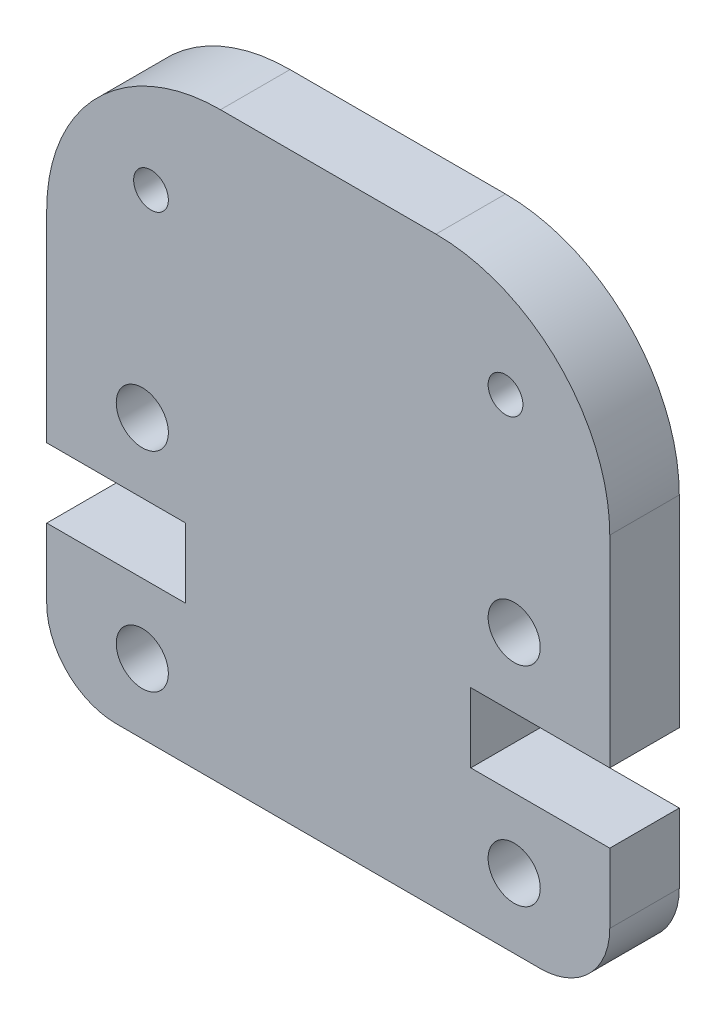
ISO-10303-21;
HEADER;
FILE_DESCRIPTION(('STEP AP214'),'2;1');
FILE_NAME('part.step','',(''),(''),'','','');
FILE_SCHEMA(('AUTOMOTIVE_DESIGN { 1 0 10303 214 1 1 1 1 }'));
ENDSEC;
DATA;
#1=APPLICATION_CONTEXT('core data for automotive mechanical design processes');
#2=APPLICATION_PROTOCOL_DEFINITION('international standard','automotive_design',2000,#1);
#3=PRODUCT_CONTEXT('',#1,'mechanical');
#4=PRODUCT('Part','Part','',(#3));
#5=PRODUCT_RELATED_PRODUCT_CATEGORY('part','',(#4));
#6=PRODUCT_DEFINITION_FORMATION('','',#4);
#7=PRODUCT_DEFINITION_CONTEXT('part definition',#1,'design');
#8=PRODUCT_DEFINITION('design','',#6,#7);
#9=PRODUCT_DEFINITION_SHAPE('','',#8);
#10=(LENGTH_UNIT() NAMED_UNIT(*) SI_UNIT(.MILLI.,.METRE.));
#11=(NAMED_UNIT(*) PLANE_ANGLE_UNIT() SI_UNIT($,.RADIAN.));
#12=(NAMED_UNIT(*) SI_UNIT($,.STERADIAN.) SOLID_ANGLE_UNIT());
#13=UNCERTAINTY_MEASURE_WITH_UNIT(LENGTH_MEASURE(1.E-05),#10,'distance_accuracy_value','');
#14=(GEOMETRIC_REPRESENTATION_CONTEXT(3) GLOBAL_UNCERTAINTY_ASSIGNED_CONTEXT((#13)) GLOBAL_UNIT_ASSIGNED_CONTEXT((#10,
#11,#12)) REPRESENTATION_CONTEXT('',''));
#15=CARTESIAN_POINT('',(0.,0.,0.));
#16=DIRECTION('',(0.,0.,1.));
#17=DIRECTION('',(1.,0.,0.));
#18=AXIS2_PLACEMENT_3D('',#15,#16,#17);
#19=CARTESIAN_POINT('',(14.2000000000041,1.99999999999997,2.));
#20=DIRECTION('',(0.,0.,1.));
#21=DIRECTION('',(1.,0.,0.));
#22=AXIS2_PLACEMENT_3D('',#19,#20,#21);
#23=PLANE('',#22);
#24=CARTESIAN_POINT('',(13.4500000000012,7.99999999999992,2.));
#25=DIRECTION('',(0.,0.,1.));
#26=DIRECTION('',(-1.,0.,0.));
#27=AXIS2_PLACEMENT_3D('',#24,#25,#26);
#28=CIRCLE('',#27,0.75);
#29=CARTESIAN_POINT('',(12.7000000000012,7.99999999999992,2.));
#30=VERTEX_POINT('',#29);
#31=EDGE_CURVE('E351',#30,#30,#28,.T.);
#32=ORIENTED_EDGE('',*,*,#31,.F.);
#33=EDGE_LOOP('',(#32));
#34=FACE_BOUND('',#33,.T.);
#35=CARTESIAN_POINT('',(13.4500000000022,1.99999999999784,2.));
#36=DIRECTION('',(0.,0.,1.));
#37=DIRECTION('',(1.,0.,0.));
#38=AXIS2_PLACEMENT_3D('',#35,#36,#37);
#39=CIRCLE('',#38,0.75);
#40=CARTESIAN_POINT('',(14.2000000000022,1.99999999999784,2.));
#41=VERTEX_POINT('',#40);
#42=EDGE_CURVE('E363',#41,#41,#39,.T.);
#43=ORIENTED_EDGE('',*,*,#42,.F.);
#44=EDGE_LOOP('',(#43));
#45=FACE_BOUND('',#44,.T.);
#46=CARTESIAN_POINT('',(3.00000000000434,13.7999999999999,2.));
#47=DIRECTION('',(0.,0.,1.));
#48=DIRECTION('',(1.,0.,0.));
#49=AXIS2_PLACEMENT_3D('',#46,#47,#48);
#50=CIRCLE('',#49,0.499999999999945);
#51=CARTESIAN_POINT('',(3.50000000000429,13.7999999999999,2.));
#52=VERTEX_POINT('',#51);
#53=EDGE_CURVE('E181',#52,#52,#50,.T.);
#54=ORIENTED_EDGE('',*,*,#53,.F.);
#55=EDGE_LOOP('',(#54));
#56=FACE_BOUND('',#55,.T.);
#57=CARTESIAN_POINT('',(14.2000000000041,1.99999999999997,2.));
#58=DIRECTION('',(0.,0.,1.));
#59=DIRECTION('',(1.,0.,0.));
#60=AXIS2_PLACEMENT_3D('',#57,#58,#59);
#61=CIRCLE('',#60,1.99999999999997);
#62=CARTESIAN_POINT('',(14.1999999999992,0.,2.));
#63=VERTEX_POINT('',#62);
#64=CARTESIAN_POINT('',(16.2000000000041,1.99999999999978,2.));
#65=VERTEX_POINT('',#64);
#66=EDGE_CURVE('E208',#63,#65,#61,.T.);
#67=ORIENTED_EDGE('',*,*,#66,.T.);
#68=DIRECTION('',(0.,1.,0.));
#69=VECTOR('',#68,1.);
#70=CARTESIAN_POINT('',(16.2000000000041,1.99999999999978,2.));
#71=LINE('',#70,#69);
#72=CARTESIAN_POINT('',(16.2000000000041,4.,2.));
#73=VERTEX_POINT('',#72);
#74=EDGE_CURVE('E116',#65,#73,#71,.T.);
#75=ORIENTED_EDGE('',*,*,#74,.T.);
#76=DIRECTION('',(-1.,0.,0.));
#77=VECTOR('',#76,1.);
#78=CARTESIAN_POINT('',(12.200000000003,4.,2.));
#79=LINE('',#78,#77);
#80=CARTESIAN_POINT('',(12.200000000003,4.,2.));
#81=VERTEX_POINT('',#80);
#82=EDGE_CURVE('E247',#73,#81,#79,.T.);
#83=ORIENTED_EDGE('',*,*,#82,.T.);
#84=DIRECTION('',(0.,1.,0.));
#85=VECTOR('',#84,1.);
#86=CARTESIAN_POINT('',(12.200000000003,5.99999999999998,2.));
#87=LINE('',#86,#85);
#88=CARTESIAN_POINT('',(12.200000000003,5.99999999999998,2.));
#89=VERTEX_POINT('',#88);
#90=EDGE_CURVE('E266',#81,#89,#87,.T.);
#91=ORIENTED_EDGE('',*,*,#90,.T.);
#92=DIRECTION('',(1.,0.,0.));
#93=VECTOR('',#92,1.);
#94=CARTESIAN_POINT('',(16.1999999999961,5.99999999999998,2.));
#95=LINE('',#94,#93);
#96=CARTESIAN_POINT('',(16.1999999999961,5.99999999999998,2.));
#97=VERTEX_POINT('',#96);
#98=EDGE_CURVE('E263',#89,#97,#95,.T.);
#99=ORIENTED_EDGE('',*,*,#98,.T.);
#100=DIRECTION('',(0.,1.,0.));
#101=VECTOR('',#100,1.);
#102=CARTESIAN_POINT('',(16.1999999999961,11.7999999999986,2.));
#103=LINE('',#102,#101);
#104=CARTESIAN_POINT('',(16.1999999999961,11.7999999999986,2.));
#105=VERTEX_POINT('',#104);
#106=EDGE_CURVE('E265',#97,#105,#103,.T.);
#107=ORIENTED_EDGE('',*,*,#106,.T.);
#108=CARTESIAN_POINT('',(11.1999999999948,11.7999999999987,2.));
#109=DIRECTION('',(0.,0.,1.));
#110=DIRECTION('',(1.,0.,0.));
#111=AXIS2_PLACEMENT_3D('',#108,#109,#110);
#112=CIRCLE('',#111,5.00000000000135);
#113=CARTESIAN_POINT('',(11.1999999999961,16.8,2.));
#114=VERTEX_POINT('',#113);
#115=EDGE_CURVE('E268',#105,#114,#112,.T.);
#116=ORIENTED_EDGE('',*,*,#115,.T.);
#117=DIRECTION('',(-1.,0.,0.));
#118=VECTOR('',#117,1.);
#119=CARTESIAN_POINT('',(4.99999999999334,16.8,2.));
#120=LINE('',#119,#118);
#121=CARTESIAN_POINT('',(4.99999999999334,16.8,2.));
#122=VERTEX_POINT('',#121);
#123=EDGE_CURVE('E274',#114,#122,#120,.T.);
#124=ORIENTED_EDGE('',*,*,#123,.T.);
#125=CARTESIAN_POINT('',(5.,11.8,2.));
#126=DIRECTION('',(0.,0.,1.));
#127=DIRECTION('',(1.,0.,0.));
#128=AXIS2_PLACEMENT_3D('',#125,#126,#127);
#129=CIRCLE('',#128,5.00000000000001);
#130=CARTESIAN_POINT('',(0.,11.8,2.));
#131=VERTEX_POINT('',#130);
#132=EDGE_CURVE('E276',#122,#131,#129,.T.);
#133=ORIENTED_EDGE('',*,*,#132,.T.);
#134=DIRECTION('',(0.,-1.,0.));
#135=VECTOR('',#134,1.);
#136=CARTESIAN_POINT('',(0.,6.00000000000001,2.));
#137=LINE('',#136,#135);
#138=CARTESIAN_POINT('',(0.,6.00000000000001,2.));
#139=VERTEX_POINT('',#138);
#140=EDGE_CURVE('E278',#131,#139,#137,.T.);
#141=ORIENTED_EDGE('',*,*,#140,.T.);
#142=DIRECTION('',(1.,0.,0.));
#143=VECTOR('',#142,1.);
#144=CARTESIAN_POINT('',(0.,6.00000000000001,2.));
#145=LINE('',#144,#143);
#146=CARTESIAN_POINT('',(4.00000000000111,6.00000000000001,2.));
#147=VERTEX_POINT('',#146);
#148=EDGE_CURVE('E280',#139,#147,#145,.T.);
#149=ORIENTED_EDGE('',*,*,#148,.T.);
#150=DIRECTION('',(0.,-1.,0.));
#151=VECTOR('',#150,1.);
#152=CARTESIAN_POINT('',(4.00000000000111,6.00000000000001,2.));
#153=LINE('',#152,#151);
#154=CARTESIAN_POINT('',(4.00000000000111,4.,2.));
#155=VERTEX_POINT('',#154);
#156=EDGE_CURVE('E282',#147,#155,#153,.T.);
#157=ORIENTED_EDGE('',*,*,#156,.T.);
#158=DIRECTION('',(-1.,0.,0.));
#159=VECTOR('',#158,1.);
#160=CARTESIAN_POINT('',(4.00000000000111,4.,2.));
#161=LINE('',#160,#159);
#162=CARTESIAN_POINT('',(0.,4.,2.));
#163=VERTEX_POINT('',#162);
#164=EDGE_CURVE('E159',#155,#163,#161,.T.);
#165=ORIENTED_EDGE('',*,*,#164,.T.);
#166=DIRECTION('',(0.,-1.,0.));
#167=VECTOR('',#166,1.);
#168=CARTESIAN_POINT('',(0.,2.,2.));
#169=LINE('',#168,#167);
#170=CARTESIAN_POINT('',(0.,2.,2.));
#171=VERTEX_POINT('',#170);
#172=EDGE_CURVE('E153',#163,#171,#169,.T.);
#173=ORIENTED_EDGE('',*,*,#172,.T.);
#174=CARTESIAN_POINT('',(2.,2.,2.));
#175=DIRECTION('',(0.,0.,1.));
#176=DIRECTION('',(1.,0.,0.));
#177=AXIS2_PLACEMENT_3D('',#174,#175,#176);
#178=CIRCLE('',#177,2.);
#179=CARTESIAN_POINT('',(2.,0.,2.));
#180=VERTEX_POINT('',#179);
#181=EDGE_CURVE('E157',#171,#180,#178,.T.);
#182=ORIENTED_EDGE('',*,*,#181,.T.);
#183=DIRECTION('',(1.,0.,0.));
#184=VECTOR('',#183,1.);
#185=CARTESIAN_POINT('',(2.,0.,2.));
#186=LINE('',#185,#184);
#187=EDGE_CURVE('E49',#180,#63,#186,.T.);
#188=ORIENTED_EDGE('',*,*,#187,.T.);
#189=EDGE_LOOP('',(#67,#75,#83,#91,#99,#107,#116,#124,#133,#141,#149,#157,#165,#173,#182,#188));
#190=FACE_BOUND('',#189,.T.);
#191=CARTESIAN_POINT('',(13.2000000000047,13.7999999999999,2.));
#192=DIRECTION('',(0.,0.,1.));
#193=DIRECTION('',(1.,0.,0.));
#194=AXIS2_PLACEMENT_3D('',#191,#192,#193);
#195=CIRCLE('',#194,0.500000000000167);
#196=CARTESIAN_POINT('',(13.7000000000048,13.7999999999999,2.));
#197=VERTEX_POINT('',#196);
#198=EDGE_CURVE('E369',#197,#197,#195,.T.);
#199=ORIENTED_EDGE('',*,*,#198,.F.);
#200=EDGE_LOOP('',(#199));
#201=FACE_BOUND('',#200,.T.);
#202=CARTESIAN_POINT('',(2.75000000000093,2.00000000000017,2.));
#203=DIRECTION('',(0.,0.,1.));
#204=DIRECTION('',(1.,0.,0.));
#205=AXIS2_PLACEMENT_3D('',#202,#203,#204);
#206=CIRCLE('',#205,0.75);
#207=CARTESIAN_POINT('',(3.50000000000093,2.00000000000017,2.));
#208=VERTEX_POINT('',#207);
#209=EDGE_CURVE('E357',#208,#208,#206,.T.);
#210=ORIENTED_EDGE('',*,*,#209,.F.);
#211=EDGE_LOOP('',(#210));
#212=FACE_BOUND('',#211,.T.);
#213=CARTESIAN_POINT('',(2.75000000000093,7.9999999999997,2.));
#214=DIRECTION('',(0.,0.,1.));
#215=DIRECTION('',(-1.,0.,0.));
#216=AXIS2_PLACEMENT_3D('',#213,#214,#215);
#217=CIRCLE('',#216,0.75);
#218=CARTESIAN_POINT('',(2.00000000000093,7.9999999999997,2.));
#219=VERTEX_POINT('',#218);
#220=EDGE_CURVE('E342',#219,#219,#217,.T.);
#221=ORIENTED_EDGE('',*,*,#220,.F.);
#222=EDGE_LOOP('',(#221));
#223=FACE_BOUND('',#222,.T.);
#224=ADVANCED_FACE('F32',(#34,#45,#56,#190,#201,#212,#223),#23,.T.);
#225=CARTESIAN_POINT('',(14.2000000000041,1.99999999999997,0.));
#226=DIRECTION('',(0.,0.,1.));
#227=DIRECTION('',(1.,0.,0.));
#228=AXIS2_PLACEMENT_3D('',#225,#226,#227);
#229=PLANE('',#228);
#230=CARTESIAN_POINT('',(13.4500000000012,7.99999999999992,0.));
#231=DIRECTION('',(0.,0.,1.));
#232=DIRECTION('',(-1.,0.,0.));
#233=AXIS2_PLACEMENT_3D('',#230,#231,#232);
#234=CIRCLE('',#233,0.75);
#235=CARTESIAN_POINT('',(12.7000000000012,7.99999999999992,0.));
#236=VERTEX_POINT('',#235);
#237=EDGE_CURVE('E348',#236,#236,#234,.T.);
#238=ORIENTED_EDGE('',*,*,#237,.T.);
#239=EDGE_LOOP('',(#238));
#240=FACE_BOUND('',#239,.T.);
#241=CARTESIAN_POINT('',(13.4500000000022,1.99999999999784,0.));
#242=DIRECTION('',(0.,0.,1.));
#243=DIRECTION('',(1.,0.,0.));
#244=AXIS2_PLACEMENT_3D('',#241,#242,#243);
#245=CIRCLE('',#244,0.75);
#246=CARTESIAN_POINT('',(14.2000000000022,1.99999999999784,0.));
#247=VERTEX_POINT('',#246);
#248=EDGE_CURVE('E360',#247,#247,#245,.T.);
#249=ORIENTED_EDGE('',*,*,#248,.T.);
#250=EDGE_LOOP('',(#249));
#251=FACE_BOUND('',#250,.T.);
#252=CARTESIAN_POINT('',(3.00000000000434,13.7999999999999,0.));
#253=DIRECTION('',(0.,0.,1.));
#254=DIRECTION('',(1.,0.,0.));
#255=AXIS2_PLACEMENT_3D('',#252,#253,#254);
#256=CIRCLE('',#255,0.499999999999945);
#257=CARTESIAN_POINT('',(3.50000000000429,13.7999999999999,0.));
#258=VERTEX_POINT('',#257);
#259=EDGE_CURVE('E372',#258,#258,#256,.T.);
#260=ORIENTED_EDGE('',*,*,#259,.T.);
#261=EDGE_LOOP('',(#260));
#262=FACE_BOUND('',#261,.T.);
#263=CARTESIAN_POINT('',(14.2000000000041,1.99999999999997,0.));
#264=DIRECTION('',(0.,0.,1.));
#265=DIRECTION('',(1.,0.,0.));
#266=AXIS2_PLACEMENT_3D('',#263,#264,#265);
#267=CIRCLE('',#266,1.99999999999997);
#268=CARTESIAN_POINT('',(14.1999999999992,0.,0.));
#269=VERTEX_POINT('',#268);
#270=CARTESIAN_POINT('',(16.2000000000041,1.99999999999978,0.));
#271=VERTEX_POINT('',#270);
#272=EDGE_CURVE('E177',#269,#271,#267,.T.);
#273=ORIENTED_EDGE('',*,*,#272,.F.);
#274=DIRECTION('',(1.,0.,0.));
#275=VECTOR('',#274,1.);
#276=CARTESIAN_POINT('',(2.,0.,0.));
#277=LINE('',#276,#275);
#278=CARTESIAN_POINT('',(2.,0.,0.));
#279=VERTEX_POINT('',#278);
#280=EDGE_CURVE('E108',#279,#269,#277,.T.);
#281=ORIENTED_EDGE('',*,*,#280,.F.);
#282=CARTESIAN_POINT('',(2.,2.,0.));
#283=DIRECTION('',(0.,0.,1.));
#284=DIRECTION('',(1.,0.,0.));
#285=AXIS2_PLACEMENT_3D('',#282,#283,#284);
#286=CIRCLE('',#285,2.);
#287=CARTESIAN_POINT('',(0.,2.,0.));
#288=VERTEX_POINT('',#287);
#289=EDGE_CURVE('E102',#288,#279,#286,.T.);
#290=ORIENTED_EDGE('',*,*,#289,.F.);
#291=DIRECTION('',(0.,-1.,0.));
#292=VECTOR('',#291,1.);
#293=CARTESIAN_POINT('',(0.,2.,0.));
#294=LINE('',#293,#292);
#295=CARTESIAN_POINT('',(0.,4.,0.));
#296=VERTEX_POINT('',#295);
#297=EDGE_CURVE('E167',#296,#288,#294,.T.);
#298=ORIENTED_EDGE('',*,*,#297,.F.);
#299=DIRECTION('',(-1.,0.,0.));
#300=VECTOR('',#299,1.);
#301=CARTESIAN_POINT('',(4.00000000000111,4.,0.));
#302=LINE('',#301,#300);
#303=CARTESIAN_POINT('',(4.00000000000111,4.,0.));
#304=VERTEX_POINT('',#303);
#305=EDGE_CURVE('E203',#304,#296,#302,.T.);
#306=ORIENTED_EDGE('',*,*,#305,.F.);
#307=DIRECTION('',(0.,-1.,0.));
#308=VECTOR('',#307,1.);
#309=CARTESIAN_POINT('',(4.00000000000111,6.00000000000001,0.));
#310=LINE('',#309,#308);
#311=CARTESIAN_POINT('',(4.00000000000111,6.00000000000001,0.));
#312=VERTEX_POINT('',#311);
#313=EDGE_CURVE('E201',#312,#304,#310,.T.);
#314=ORIENTED_EDGE('',*,*,#313,.F.);
#315=DIRECTION('',(1.,0.,0.));
#316=VECTOR('',#315,1.);
#317=CARTESIAN_POINT('',(0.,6.00000000000001,0.));
#318=LINE('',#317,#316);
#319=CARTESIAN_POINT('',(0.,6.00000000000001,0.));
#320=VERTEX_POINT('',#319);
#321=EDGE_CURVE('E199',#320,#312,#318,.T.);
#322=ORIENTED_EDGE('',*,*,#321,.F.);
#323=DIRECTION('',(0.,-1.,0.));
#324=VECTOR('',#323,1.);
#325=CARTESIAN_POINT('',(0.,6.00000000000001,0.));
#326=LINE('',#325,#324);
#327=CARTESIAN_POINT('',(0.,11.8,0.));
#328=VERTEX_POINT('',#327);
#329=EDGE_CURVE('E197',#328,#320,#326,.T.);
#330=ORIENTED_EDGE('',*,*,#329,.F.);
#331=CARTESIAN_POINT('',(5.,11.8,0.));
#332=DIRECTION('',(0.,0.,1.));
#333=DIRECTION('',(1.,0.,0.));
#334=AXIS2_PLACEMENT_3D('',#331,#332,#333);
#335=CIRCLE('',#334,5.00000000000001);
#336=CARTESIAN_POINT('',(4.99999999999334,16.8,0.));
#337=VERTEX_POINT('',#336);
#338=EDGE_CURVE('E195',#337,#328,#335,.T.);
#339=ORIENTED_EDGE('',*,*,#338,.F.);
#340=DIRECTION('',(-1.,0.,0.));
#341=VECTOR('',#340,1.);
#342=CARTESIAN_POINT('',(4.99999999999334,16.8,0.));
#343=LINE('',#342,#341);
#344=CARTESIAN_POINT('',(11.1999999999961,16.8,0.));
#345=VERTEX_POINT('',#344);
#346=EDGE_CURVE('E193',#345,#337,#343,.T.);
#347=ORIENTED_EDGE('',*,*,#346,.F.);
#348=CARTESIAN_POINT('',(11.1999999999948,11.7999999999987,0.));
#349=DIRECTION('',(0.,0.,1.));
#350=DIRECTION('',(1.,0.,0.));
#351=AXIS2_PLACEMENT_3D('',#348,#349,#350);
#352=CIRCLE('',#351,5.00000000000135);
#353=CARTESIAN_POINT('',(16.1999999999961,11.7999999999986,0.));
#354=VERTEX_POINT('',#353);
#355=EDGE_CURVE('E191',#354,#345,#352,.T.);
#356=ORIENTED_EDGE('',*,*,#355,.F.);
#357=DIRECTION('',(0.,1.,0.));
#358=VECTOR('',#357,1.);
#359=CARTESIAN_POINT('',(16.1999999999961,11.7999999999986,0.));
#360=LINE('',#359,#358);
#361=CARTESIAN_POINT('',(16.1999999999961,5.99999999999998,0.));
#362=VERTEX_POINT('',#361);
#363=EDGE_CURVE('E189',#362,#354,#360,.T.);
#364=ORIENTED_EDGE('',*,*,#363,.F.);
#365=DIRECTION('',(1.,0.,0.));
#366=VECTOR('',#365,1.);
#367=CARTESIAN_POINT('',(16.1999999999961,5.99999999999998,0.));
#368=LINE('',#367,#366);
#369=CARTESIAN_POINT('',(12.200000000003,5.99999999999998,0.));
#370=VERTEX_POINT('',#369);
#371=EDGE_CURVE('E187',#370,#362,#368,.T.);
#372=ORIENTED_EDGE('',*,*,#371,.F.);
#373=DIRECTION('',(0.,1.,0.));
#374=VECTOR('',#373,1.);
#375=CARTESIAN_POINT('',(12.200000000003,5.99999999999998,0.));
#376=LINE('',#375,#374);
#377=CARTESIAN_POINT('',(12.200000000003,4.,0.));
#378=VERTEX_POINT('',#377);
#379=EDGE_CURVE('E185',#378,#370,#376,.T.);
#380=ORIENTED_EDGE('',*,*,#379,.F.);
#381=DIRECTION('',(-1.,0.,0.));
#382=VECTOR('',#381,1.);
#383=CARTESIAN_POINT('',(12.200000000003,4.,0.));
#384=LINE('',#383,#382);
#385=CARTESIAN_POINT('',(16.2000000000041,4.,0.));
#386=VERTEX_POINT('',#385);
#387=EDGE_CURVE('E183',#386,#378,#384,.T.);
#388=ORIENTED_EDGE('',*,*,#387,.F.);
#389=DIRECTION('',(0.,1.,0.));
#390=VECTOR('',#389,1.);
#391=CARTESIAN_POINT('',(16.2000000000041,1.99999999999978,0.));
#392=LINE('',#391,#390);
#393=EDGE_CURVE('E180',#271,#386,#392,.T.);
#394=ORIENTED_EDGE('',*,*,#393,.F.);
#395=EDGE_LOOP('',(#273,#281,#290,#298,#306,#314,#322,#330,#339,#347,#356,#364,#372,#380,#388,#394));
#396=FACE_BOUND('',#395,.T.);
#397=CARTESIAN_POINT('',(13.2000000000047,13.7999999999999,0.));
#398=DIRECTION('',(0.,0.,1.));
#399=DIRECTION('',(1.,0.,0.));
#400=AXIS2_PLACEMENT_3D('',#397,#398,#399);
#401=CIRCLE('',#400,0.500000000000167);
#402=CARTESIAN_POINT('',(13.7000000000048,13.7999999999999,0.));
#403=VERTEX_POINT('',#402);
#404=EDGE_CURVE('E366',#403,#403,#401,.T.);
#405=ORIENTED_EDGE('',*,*,#404,.T.);
#406=EDGE_LOOP('',(#405));
#407=FACE_BOUND('',#406,.T.);
#408=CARTESIAN_POINT('',(2.75000000000093,2.00000000000017,0.));
#409=DIRECTION('',(0.,0.,1.));
#410=DIRECTION('',(1.,0.,0.));
#411=AXIS2_PLACEMENT_3D('',#408,#409,#410);
#412=CIRCLE('',#411,0.75);
#413=CARTESIAN_POINT('',(3.50000000000093,2.00000000000017,0.));
#414=VERTEX_POINT('',#413);
#415=EDGE_CURVE('E354',#414,#414,#412,.T.);
#416=ORIENTED_EDGE('',*,*,#415,.T.);
#417=EDGE_LOOP('',(#416));
#418=FACE_BOUND('',#417,.T.);
#419=CARTESIAN_POINT('',(2.75000000000093,7.9999999999997,0.));
#420=DIRECTION('',(0.,0.,1.));
#421=DIRECTION('',(-1.,0.,0.));
#422=AXIS2_PLACEMENT_3D('',#419,#420,#421);
#423=CIRCLE('',#422,0.75);
#424=CARTESIAN_POINT('',(2.00000000000093,7.9999999999997,0.));
#425=VERTEX_POINT('',#424);
#426=EDGE_CURVE('E345',#425,#425,#423,.T.);
#427=ORIENTED_EDGE('',*,*,#426,.T.);
#428=EDGE_LOOP('',(#427));
#429=FACE_BOUND('',#428,.T.);
#430=ADVANCED_FACE('F251',(#240,#251,#262,#396,#407,#418,#429),#229,.F.);
#431=CARTESIAN_POINT('',(14.2000000000041,1.99999999999997,2.));
#432=DIRECTION('',(0.,0.,-1.));
#433=DIRECTION('',(-1.,0.,0.));
#434=AXIS2_PLACEMENT_3D('',#431,#432,#433);
#435=CYLINDRICAL_SURFACE('',#434,1.99999999999997);
#436=ORIENTED_EDGE('',*,*,#272,.T.);
#437=DIRECTION('',(0.,0.,-1.));
#438=VECTOR('',#437,1.);
#439=CARTESIAN_POINT('',(16.2000000000041,1.99999999999978,2.));
#440=LINE('',#439,#438);
#441=EDGE_CURVE('E11',#65,#271,#440,.T.);
#442=ORIENTED_EDGE('',*,*,#441,.F.);
#443=ORIENTED_EDGE('',*,*,#66,.F.);
#444=DIRECTION('',(0.,0.,-1.));
#445=VECTOR('',#444,1.);
#446=CARTESIAN_POINT('',(14.1999999999992,0.,2.));
#447=LINE('',#446,#445);
#448=EDGE_CURVE('E173',#63,#269,#447,.T.);
#449=ORIENTED_EDGE('',*,*,#448,.T.);
#450=EDGE_LOOP('',(#436,#442,#443,#449));
#451=FACE_BOUND('',#450,.T.);
#452=ADVANCED_FACE('F34',(#451),#435,.T.);
#453=CARTESIAN_POINT('',(16.2000000000041,1.99999999999978,2.));
#454=DIRECTION('',(-1.,0.,0.));
#455=DIRECTION('',(0.,0.,1.));
#456=AXIS2_PLACEMENT_3D('',#453,#454,#455);
#457=PLANE('',#456);
#458=ORIENTED_EDGE('',*,*,#393,.T.);
#459=DIRECTION('',(0.,0.,-1.));
#460=VECTOR('',#459,1.);
#461=CARTESIAN_POINT('',(16.2000000000041,4.,2.));
#462=LINE('',#461,#460);
#463=EDGE_CURVE('E41',#73,#386,#462,.T.);
#464=ORIENTED_EDGE('',*,*,#463,.F.);
#465=ORIENTED_EDGE('',*,*,#74,.F.);
#466=ORIENTED_EDGE('',*,*,#441,.T.);
#467=EDGE_LOOP('',(#458,#464,#465,#466));
#468=FACE_BOUND('',#467,.T.);
#469=ADVANCED_FACE('F539',(#468),#457,.F.);
#470=CARTESIAN_POINT('',(12.200000000003,4.,2.));
#471=DIRECTION('',(0.,-1.,0.));
#472=DIRECTION('',(0.,0.,-1.));
#473=AXIS2_PLACEMENT_3D('',#470,#471,#472);
#474=PLANE('',#473);
#475=ORIENTED_EDGE('',*,*,#387,.T.);
#476=DIRECTION('',(0.,0.,-1.));
#477=VECTOR('',#476,1.);
#478=CARTESIAN_POINT('',(12.200000000003,4.,2.));
#479=LINE('',#478,#477);
#480=EDGE_CURVE('E239',#81,#378,#479,.T.);
#481=ORIENTED_EDGE('',*,*,#480,.F.);
#482=ORIENTED_EDGE('',*,*,#82,.F.);
#483=ORIENTED_EDGE('',*,*,#463,.T.);
#484=EDGE_LOOP('',(#475,#481,#482,#483));
#485=FACE_BOUND('',#484,.T.);
#486=ADVANCED_FACE('F245',(#485),#474,.F.);
#487=CARTESIAN_POINT('',(12.200000000003,5.99999999999998,2.));
#488=DIRECTION('',(-1.,0.,0.));
#489=DIRECTION('',(0.,0.,1.));
#490=AXIS2_PLACEMENT_3D('',#487,#488,#489);
#491=PLANE('',#490);
#492=ORIENTED_EDGE('',*,*,#379,.T.);
#493=DIRECTION('',(0.,0.,-1.));
#494=VECTOR('',#493,1.);
#495=CARTESIAN_POINT('',(12.200000000003,5.99999999999998,2.));
#496=LINE('',#495,#494);
#497=EDGE_CURVE('E236',#89,#370,#496,.T.);
#498=ORIENTED_EDGE('',*,*,#497,.F.);
#499=ORIENTED_EDGE('',*,*,#90,.F.);
#500=ORIENTED_EDGE('',*,*,#480,.T.);
#501=EDGE_LOOP('',(#492,#498,#499,#500));
#502=FACE_BOUND('',#501,.T.);
#503=ADVANCED_FACE('F257',(#502),#491,.F.);
#504=CARTESIAN_POINT('',(16.1999999999961,5.99999999999998,2.));
#505=DIRECTION('',(0.,1.,0.));
#506=DIRECTION('',(0.,0.,1.));
#507=AXIS2_PLACEMENT_3D('',#504,#505,#506);
#508=PLANE('',#507);
#509=ORIENTED_EDGE('',*,*,#371,.T.);
#510=DIRECTION('',(0.,0.,-1.));
#511=VECTOR('',#510,1.);
#512=CARTESIAN_POINT('',(16.1999999999961,5.99999999999998,2.));
#513=LINE('',#512,#511);
#514=EDGE_CURVE('E233',#97,#362,#513,.T.);
#515=ORIENTED_EDGE('',*,*,#514,.F.);
#516=ORIENTED_EDGE('',*,*,#98,.F.);
#517=ORIENTED_EDGE('',*,*,#497,.T.);
#518=EDGE_LOOP('',(#509,#515,#516,#517));
#519=FACE_BOUND('',#518,.T.);
#520=ADVANCED_FACE('F261',(#519),#508,.F.);
#521=CARTESIAN_POINT('',(16.1999999999961,11.7999999999986,2.));
#522=DIRECTION('',(-1.,0.,0.));
#523=DIRECTION('',(0.,0.,1.));
#524=AXIS2_PLACEMENT_3D('',#521,#522,#523);
#525=PLANE('',#524);
#526=ORIENTED_EDGE('',*,*,#363,.T.);
#527=DIRECTION('',(0.,0.,-1.));
#528=VECTOR('',#527,1.);
#529=CARTESIAN_POINT('',(16.1999999999961,11.7999999999986,2.));
#530=LINE('',#529,#528);
#531=EDGE_CURVE('E230',#105,#354,#530,.T.);
#532=ORIENTED_EDGE('',*,*,#531,.F.);
#533=ORIENTED_EDGE('',*,*,#106,.F.);
#534=ORIENTED_EDGE('',*,*,#514,.T.);
#535=EDGE_LOOP('',(#526,#532,#533,#534));
#536=FACE_BOUND('',#535,.T.);
#537=ADVANCED_FACE('F504',(#536),#525,.F.);
#538=CARTESIAN_POINT('',(11.1999999999948,11.7999999999987,2.));
#539=DIRECTION('',(0.,0.,-1.));
#540=DIRECTION('',(-1.,0.,0.));
#541=AXIS2_PLACEMENT_3D('',#538,#539,#540);
#542=CYLINDRICAL_SURFACE('',#541,5.00000000000135);
#543=ORIENTED_EDGE('',*,*,#355,.T.);
#544=DIRECTION('',(0.,0.,-1.));
#545=VECTOR('',#544,1.);
#546=CARTESIAN_POINT('',(11.1999999999961,16.8,2.));
#547=LINE('',#546,#545);
#548=EDGE_CURVE('E227',#114,#345,#547,.T.);
#549=ORIENTED_EDGE('',*,*,#548,.F.);
#550=ORIENTED_EDGE('',*,*,#115,.F.);
#551=ORIENTED_EDGE('',*,*,#531,.T.);
#552=EDGE_LOOP('',(#543,#549,#550,#551));
#553=FACE_BOUND('',#552,.T.);
#554=ADVANCED_FACE('F494',(#553),#542,.T.);
#555=CARTESIAN_POINT('',(4.99999999999334,16.8,2.));
#556=DIRECTION('',(0.,-1.,0.));
#557=DIRECTION('',(0.,0.,-1.));
#558=AXIS2_PLACEMENT_3D('',#555,#556,#557);
#559=PLANE('',#558);
#560=ORIENTED_EDGE('',*,*,#346,.T.);
#561=DIRECTION('',(0.,0.,-1.));
#562=VECTOR('',#561,1.);
#563=CARTESIAN_POINT('',(4.99999999999334,16.8,2.));
#564=LINE('',#563,#562);
#565=EDGE_CURVE('E224',#122,#337,#564,.T.);
#566=ORIENTED_EDGE('',*,*,#565,.F.);
#567=ORIENTED_EDGE('',*,*,#123,.F.);
#568=ORIENTED_EDGE('',*,*,#548,.T.);
#569=EDGE_LOOP('',(#560,#566,#567,#568));
#570=FACE_BOUND('',#569,.T.);
#571=ADVANCED_FACE('F484',(#570),#559,.F.);
#572=CARTESIAN_POINT('',(5.,11.8,2.));
#573=DIRECTION('',(0.,0.,-1.));
#574=DIRECTION('',(-1.,0.,0.));
#575=AXIS2_PLACEMENT_3D('',#572,#573,#574);
#576=CYLINDRICAL_SURFACE('',#575,5.00000000000001);
#577=ORIENTED_EDGE('',*,*,#338,.T.);
#578=DIRECTION('',(0.,0.,-1.));
#579=VECTOR('',#578,1.);
#580=CARTESIAN_POINT('',(0.,11.8,2.));
#581=LINE('',#580,#579);
#582=EDGE_CURVE('E221',#131,#328,#581,.T.);
#583=ORIENTED_EDGE('',*,*,#582,.F.);
#584=ORIENTED_EDGE('',*,*,#132,.F.);
#585=ORIENTED_EDGE('',*,*,#565,.T.);
#586=EDGE_LOOP('',(#577,#583,#584,#585));
#587=FACE_BOUND('',#586,.T.);
#588=ADVANCED_FACE('F474',(#587),#576,.T.);
#589=CARTESIAN_POINT('',(0.,6.00000000000001,2.));
#590=DIRECTION('',(1.,0.,0.));
#591=DIRECTION('',(0.,0.,-1.));
#592=AXIS2_PLACEMENT_3D('',#589,#590,#591);
#593=PLANE('',#592);
#594=ORIENTED_EDGE('',*,*,#329,.T.);
#595=DIRECTION('',(0.,0.,-1.));
#596=VECTOR('',#595,1.);
#597=CARTESIAN_POINT('',(0.,6.00000000000001,2.));
#598=LINE('',#597,#596);
#599=EDGE_CURVE('E218',#139,#320,#598,.T.);
#600=ORIENTED_EDGE('',*,*,#599,.F.);
#601=ORIENTED_EDGE('',*,*,#140,.F.);
#602=ORIENTED_EDGE('',*,*,#582,.T.);
#603=EDGE_LOOP('',(#594,#600,#601,#602));
#604=FACE_BOUND('',#603,.T.);
#605=ADVANCED_FACE('F464',(#604),#593,.F.);
#606=CARTESIAN_POINT('',(0.,6.00000000000001,2.));
#607=DIRECTION('',(0.,1.,0.));
#608=DIRECTION('',(0.,0.,1.));
#609=AXIS2_PLACEMENT_3D('',#606,#607,#608);
#610=PLANE('',#609);
#611=ORIENTED_EDGE('',*,*,#321,.T.);
#612=DIRECTION('',(0.,0.,-1.));
#613=VECTOR('',#612,1.);
#614=CARTESIAN_POINT('',(4.00000000000111,6.00000000000001,2.));
#615=LINE('',#614,#613);
#616=EDGE_CURVE('E215',#147,#312,#615,.T.);
#617=ORIENTED_EDGE('',*,*,#616,.F.);
#618=ORIENTED_EDGE('',*,*,#148,.F.);
#619=ORIENTED_EDGE('',*,*,#599,.T.);
#620=EDGE_LOOP('',(#611,#617,#618,#619));
#621=FACE_BOUND('',#620,.T.);
#622=ADVANCED_FACE('F455',(#621),#610,.F.);
#623=CARTESIAN_POINT('',(4.00000000000111,6.00000000000001,2.));
#624=DIRECTION('',(1.,0.,0.));
#625=DIRECTION('',(0.,0.,-1.));
#626=AXIS2_PLACEMENT_3D('',#623,#624,#625);
#627=PLANE('',#626);
#628=ORIENTED_EDGE('',*,*,#313,.T.);
#629=DIRECTION('',(0.,0.,-1.));
#630=VECTOR('',#629,1.);
#631=CARTESIAN_POINT('',(4.00000000000111,4.,2.));
#632=LINE('',#631,#630);
#633=EDGE_CURVE('E212',#155,#304,#632,.T.);
#634=ORIENTED_EDGE('',*,*,#633,.F.);
#635=ORIENTED_EDGE('',*,*,#156,.F.);
#636=ORIENTED_EDGE('',*,*,#616,.T.);
#637=EDGE_LOOP('',(#628,#634,#635,#636));
#638=FACE_BOUND('',#637,.T.);
#639=ADVANCED_FACE('F288',(#638),#627,.F.);
#640=CARTESIAN_POINT('',(4.00000000000111,4.,2.));
#641=DIRECTION('',(0.,-1.,0.));
#642=DIRECTION('',(0.,0.,-1.));
#643=AXIS2_PLACEMENT_3D('',#640,#641,#642);
#644=PLANE('',#643);
#645=ORIENTED_EDGE('',*,*,#305,.T.);
#646=DIRECTION('',(0.,0.,-1.));
#647=VECTOR('',#646,1.);
#648=CARTESIAN_POINT('',(0.,4.,2.));
#649=LINE('',#648,#647);
#650=EDGE_CURVE('E168',#163,#296,#649,.T.);
#651=ORIENTED_EDGE('',*,*,#650,.F.);
#652=ORIENTED_EDGE('',*,*,#164,.F.);
#653=ORIENTED_EDGE('',*,*,#633,.T.);
#654=EDGE_LOOP('',(#645,#651,#652,#653));
#655=FACE_BOUND('',#654,.T.);
#656=ADVANCED_FACE('F292',(#655),#644,.F.);
#657=CARTESIAN_POINT('',(0.,2.,2.));
#658=DIRECTION('',(1.,0.,0.));
#659=DIRECTION('',(0.,0.,-1.));
#660=AXIS2_PLACEMENT_3D('',#657,#658,#659);
#661=PLANE('',#660);
#662=ORIENTED_EDGE('',*,*,#297,.T.);
#663=DIRECTION('',(0.,0.,-1.));
#664=VECTOR('',#663,1.);
#665=CARTESIAN_POINT('',(0.,2.,2.));
#666=LINE('',#665,#664);
#667=EDGE_CURVE('E164',#171,#288,#666,.T.);
#668=ORIENTED_EDGE('',*,*,#667,.F.);
#669=ORIENTED_EDGE('',*,*,#172,.F.);
#670=ORIENTED_EDGE('',*,*,#650,.T.);
#671=EDGE_LOOP('',(#662,#668,#669,#670));
#672=FACE_BOUND('',#671,.T.);
#673=ADVANCED_FACE('F165',(#672),#661,.F.);
#674=CARTESIAN_POINT('',(2.,2.,2.));
#675=DIRECTION('',(0.,0.,-1.));
#676=DIRECTION('',(-1.,0.,0.));
#677=AXIS2_PLACEMENT_3D('',#674,#675,#676);
#678=CYLINDRICAL_SURFACE('',#677,2.);
#679=ORIENTED_EDGE('',*,*,#289,.T.);
#680=DIRECTION('',(0.,0.,-1.));
#681=VECTOR('',#680,1.);
#682=CARTESIAN_POINT('',(2.,0.,2.));
#683=LINE('',#682,#681);
#684=EDGE_CURVE('E169',#180,#279,#683,.T.);
#685=ORIENTED_EDGE('',*,*,#684,.F.);
#686=ORIENTED_EDGE('',*,*,#181,.F.);
#687=ORIENTED_EDGE('',*,*,#667,.T.);
#688=EDGE_LOOP('',(#679,#685,#686,#687));
#689=FACE_BOUND('',#688,.T.);
#690=ADVANCED_FACE('F171',(#689),#678,.T.);
#691=CARTESIAN_POINT('',(2.,0.,2.));
#692=DIRECTION('',(0.,1.,0.));
#693=DIRECTION('',(0.,0.,1.));
#694=AXIS2_PLACEMENT_3D('',#691,#692,#693);
#695=PLANE('',#694);
#696=ORIENTED_EDGE('',*,*,#280,.T.);
#697=ORIENTED_EDGE('',*,*,#448,.F.);
#698=ORIENTED_EDGE('',*,*,#187,.F.);
#699=ORIENTED_EDGE('',*,*,#684,.T.);
#700=EDGE_LOOP('',(#696,#697,#698,#699));
#701=FACE_BOUND('',#700,.T.);
#702=ADVANCED_FACE('F296',(#701),#695,.F.);
#703=CARTESIAN_POINT('',(3.00000000000434,13.7999999999999,2.));
#704=DIRECTION('',(0.,0.,-1.));
#705=DIRECTION('',(-1.,0.,0.));
#706=AXIS2_PLACEMENT_3D('',#703,#704,#705);
#707=CYLINDRICAL_SURFACE('',#706,0.499999999999945);
#708=ORIENTED_EDGE('',*,*,#53,.T.);
#709=EDGE_LOOP('',(#708));
#710=FACE_BOUND('',#709,.T.);
#711=ORIENTED_EDGE('',*,*,#259,.F.);
#712=EDGE_LOOP('',(#711));
#713=FACE_BOUND('',#712,.T.);
#714=ADVANCED_FACE('F298',(#710,#713),#707,.F.);
#715=CARTESIAN_POINT('',(13.2000000000047,13.7999999999999,2.));
#716=DIRECTION('',(0.,0.,-1.));
#717=DIRECTION('',(-1.,0.,0.));
#718=AXIS2_PLACEMENT_3D('',#715,#716,#717);
#719=CYLINDRICAL_SURFACE('',#718,0.500000000000167);
#720=ORIENTED_EDGE('',*,*,#198,.T.);
#721=EDGE_LOOP('',(#720));
#722=FACE_BOUND('',#721,.T.);
#723=ORIENTED_EDGE('',*,*,#404,.F.);
#724=EDGE_LOOP('',(#723));
#725=FACE_BOUND('',#724,.T.);
#726=ADVANCED_FACE('F304',(#722,#725),#719,.F.);
#727=CARTESIAN_POINT('',(13.4500000000022,1.99999999999784,2.));
#728=DIRECTION('',(0.,0.,-1.));
#729=DIRECTION('',(-1.,0.,0.));
#730=AXIS2_PLACEMENT_3D('',#727,#728,#729);
#731=CYLINDRICAL_SURFACE('',#730,0.75);
#732=ORIENTED_EDGE('',*,*,#42,.T.);
#733=EDGE_LOOP('',(#732));
#734=FACE_BOUND('',#733,.T.);
#735=ORIENTED_EDGE('',*,*,#248,.F.);
#736=EDGE_LOOP('',(#735));
#737=FACE_BOUND('',#736,.T.);
#738=ADVANCED_FACE('F321',(#734,#737),#731,.F.);
#739=CARTESIAN_POINT('',(2.75000000000093,2.00000000000017,2.));
#740=DIRECTION('',(0.,0.,-1.));
#741=DIRECTION('',(-1.,0.,0.));
#742=AXIS2_PLACEMENT_3D('',#739,#740,#741);
#743=CYLINDRICAL_SURFACE('',#742,0.75);
#744=ORIENTED_EDGE('',*,*,#209,.T.);
#745=EDGE_LOOP('',(#744));
#746=FACE_BOUND('',#745,.T.);
#747=ORIENTED_EDGE('',*,*,#415,.F.);
#748=EDGE_LOOP('',(#747));
#749=FACE_BOUND('',#748,.T.);
#750=ADVANCED_FACE('F325',(#746,#749),#743,.F.);
#751=CARTESIAN_POINT('',(13.4500000000012,7.99999999999992,2.));
#752=DIRECTION('',(0.,0.,-1.));
#753=DIRECTION('',(-1.,0.,0.));
#754=AXIS2_PLACEMENT_3D('',#751,#752,#753);
#755=CYLINDRICAL_SURFACE('',#754,0.75);
#756=ORIENTED_EDGE('',*,*,#31,.T.);
#757=EDGE_LOOP('',(#756));
#758=FACE_BOUND('',#757,.T.);
#759=ORIENTED_EDGE('',*,*,#237,.F.);
#760=EDGE_LOOP('',(#759));
#761=FACE_BOUND('',#760,.T.);
#762=ADVANCED_FACE('F329',(#758,#761),#755,.F.);
#763=CARTESIAN_POINT('',(2.75000000000093,7.9999999999997,2.));
#764=DIRECTION('',(0.,0.,-1.));
#765=DIRECTION('',(-1.,0.,0.));
#766=AXIS2_PLACEMENT_3D('',#763,#764,#765);
#767=CYLINDRICAL_SURFACE('',#766,0.75);
#768=ORIENTED_EDGE('',*,*,#220,.T.);
#769=EDGE_LOOP('',(#768));
#770=FACE_BOUND('',#769,.T.);
#771=ORIENTED_EDGE('',*,*,#426,.F.);
#772=EDGE_LOOP('',(#771));
#773=FACE_BOUND('',#772,.T.);
#774=ADVANCED_FACE('F333',(#770,#773),#767,.F.);
#775=CLOSED_SHELL('',(#224,#430,#452,#469,#486,#503,#520,#537,#554,#571,#588,#605,#622,#639,
#656,#673,#690,#702,#714,#726,#738,#750,#762,#774));
#776=MANIFOLD_SOLID_BREP('B2',#775);
#777=ADVANCED_BREP_SHAPE_REPRESENTATION('',(#18,#776),#14);
#778=SHAPE_DEFINITION_REPRESENTATION(#9,#777);
ENDSEC;
END-ISO-10303-21;
